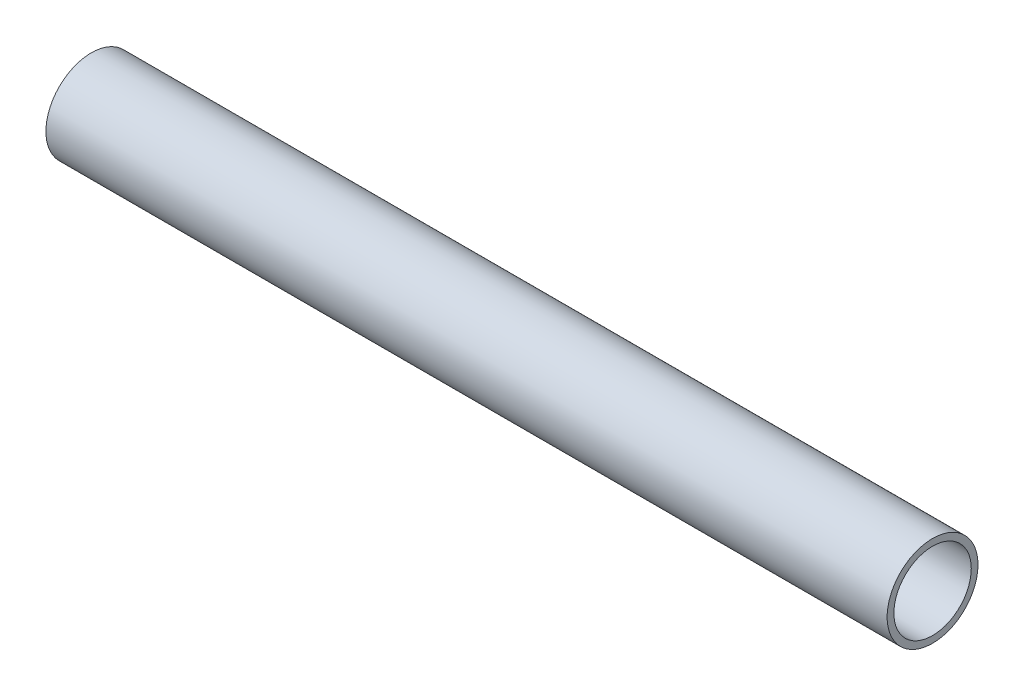
ISO-10303-21;
HEADER;
FILE_DESCRIPTION(('STEP AP214'),'2;1');
FILE_NAME('part.step','',(''),(''),'','','');
FILE_SCHEMA(('AUTOMOTIVE_DESIGN { 1 0 10303 214 1 1 1 1 }'));
ENDSEC;
DATA;
#1=APPLICATION_CONTEXT('core data for automotive mechanical design processes');
#2=APPLICATION_PROTOCOL_DEFINITION('international standard','automotive_design',2000,#1);
#3=PRODUCT_CONTEXT('',#1,'mechanical');
#4=PRODUCT('Part','Part','',(#3));
#5=PRODUCT_RELATED_PRODUCT_CATEGORY('part','',(#4));
#6=PRODUCT_DEFINITION_FORMATION('','',#4);
#7=PRODUCT_DEFINITION_CONTEXT('part definition',#1,'design');
#8=PRODUCT_DEFINITION('design','',#6,#7);
#9=PRODUCT_DEFINITION_SHAPE('','',#8);
#10=(LENGTH_UNIT() NAMED_UNIT(*) SI_UNIT(.MILLI.,.METRE.));
#11=(NAMED_UNIT(*) PLANE_ANGLE_UNIT() SI_UNIT($,.RADIAN.));
#12=(NAMED_UNIT(*) SI_UNIT($,.STERADIAN.) SOLID_ANGLE_UNIT());
#13=UNCERTAINTY_MEASURE_WITH_UNIT(LENGTH_MEASURE(1.E-05),#10,'distance_accuracy_value','');
#14=(GEOMETRIC_REPRESENTATION_CONTEXT(3) GLOBAL_UNCERTAINTY_ASSIGNED_CONTEXT((#13)) GLOBAL_UNIT_ASSIGNED_CONTEXT((#10,
#11,#12)) REPRESENTATION_CONTEXT('',''));
#15=CARTESIAN_POINT('',(0.,0.,0.));
#16=DIRECTION('',(0.,0.,1.));
#17=DIRECTION('',(1.,0.,0.));
#18=AXIS2_PLACEMENT_3D('',#15,#16,#17);
#19=CARTESIAN_POINT('',(-200.,300.,-250.));
#20=DIRECTION('',(-1.,0.,0.));
#21=DIRECTION('',(0.,0.,-1.));
#22=AXIS2_PLACEMENT_3D('',#19,#20,#21);
#23=CYLINDRICAL_SURFACE('',#22,13.5);
#24=CARTESIAN_POINT('',(-200.,300.,-250.));
#25=DIRECTION('',(1.,0.,0.));
#26=DIRECTION('',(0.,0.,-1.));
#27=AXIS2_PLACEMENT_3D('',#24,#25,#26);
#28=CIRCLE('',#27,13.5);
#29=CARTESIAN_POINT('',(-200.,300.,-263.5));
#30=VERTEX_POINT('',#29);
#31=EDGE_CURVE('E10',#30,#30,#28,.T.);
#32=CARTESIAN_POINT('',(-450.,300.,-250.));
#33=DIRECTION('',(1.,0.,0.));
#34=DIRECTION('',(0.,0.,-1.));
#35=AXIS2_PLACEMENT_3D('',#32,#33,#34);
#36=CIRCLE('',#35,13.5);
#37=CARTESIAN_POINT('',(-450.,300.,-263.5));
#38=VERTEX_POINT('',#37);
#39=EDGE_CURVE('E49',#38,#38,#36,.T.);
#40=CARTESIAN_POINT('',(-200.,300.,-263.5));
#41=CARTESIAN_POINT('',(-202.604166666667,300.,-263.5));
#42=CARTESIAN_POINT('',(-205.208333333333,300.,-263.5));
#43=CARTESIAN_POINT('',(-210.416666666667,300.,-263.5));
#44=CARTESIAN_POINT('',(-213.020833333333,300.,-263.5));
#45=CARTESIAN_POINT('',(-218.229166666667,300.,-263.5));
#46=CARTESIAN_POINT('',(-220.833333333333,300.,-263.5));
#47=CARTESIAN_POINT('',(-226.041666666667,300.,-263.5));
#48=CARTESIAN_POINT('',(-228.645833333333,300.,-263.5));
#49=CARTESIAN_POINT('',(-233.854166666667,300.,-263.5));
#50=CARTESIAN_POINT('',(-236.458333333333,300.,-263.5));
#51=CARTESIAN_POINT('',(-241.666666666667,300.,-263.5));
#52=CARTESIAN_POINT('',(-244.270833333333,300.,-263.5));
#53=CARTESIAN_POINT('',(-249.479166666667,300.,-263.5));
#54=CARTESIAN_POINT('',(-252.083333333333,300.,-263.5));
#55=CARTESIAN_POINT('',(-257.291666666667,300.,-263.5));
#56=CARTESIAN_POINT('',(-259.895833333333,300.,-263.5));
#57=CARTESIAN_POINT('',(-265.104166666667,300.,-263.5));
#58=CARTESIAN_POINT('',(-267.708333333333,300.,-263.5));
#59=CARTESIAN_POINT('',(-272.916666666667,300.,-263.5));
#60=CARTESIAN_POINT('',(-275.520833333333,300.,-263.5));
#61=CARTESIAN_POINT('',(-280.729166666667,300.,-263.5));
#62=CARTESIAN_POINT('',(-283.333333333333,300.,-263.5));
#63=CARTESIAN_POINT('',(-288.541666666667,300.,-263.5));
#64=CARTESIAN_POINT('',(-291.145833333333,300.,-263.5));
#65=CARTESIAN_POINT('',(-296.354166666667,300.,-263.5));
#66=CARTESIAN_POINT('',(-298.958333333333,300.,-263.5));
#67=CARTESIAN_POINT('',(-304.166666666667,300.,-263.5));
#68=CARTESIAN_POINT('',(-306.770833333333,300.,-263.5));
#69=CARTESIAN_POINT('',(-311.979166666667,300.,-263.5));
#70=CARTESIAN_POINT('',(-314.583333333333,300.,-263.5));
#71=CARTESIAN_POINT('',(-319.791666666667,300.,-263.5));
#72=CARTESIAN_POINT('',(-322.395833333333,300.,-263.5));
#73=CARTESIAN_POINT('',(-327.604166666667,300.,-263.5));
#74=CARTESIAN_POINT('',(-330.208333333333,300.,-263.5));
#75=CARTESIAN_POINT('',(-335.416666666667,300.,-263.5));
#76=CARTESIAN_POINT('',(-338.020833333333,300.,-263.5));
#77=CARTESIAN_POINT('',(-343.229166666667,300.,-263.5));
#78=CARTESIAN_POINT('',(-345.833333333333,300.,-263.5));
#79=CARTESIAN_POINT('',(-351.041666666667,300.,-263.5));
#80=CARTESIAN_POINT('',(-353.645833333333,300.,-263.5));
#81=CARTESIAN_POINT('',(-358.854166666667,300.,-263.5));
#82=CARTESIAN_POINT('',(-361.458333333333,300.,-263.5));
#83=CARTESIAN_POINT('',(-366.666666666667,300.,-263.5));
#84=CARTESIAN_POINT('',(-369.270833333333,300.,-263.5));
#85=CARTESIAN_POINT('',(-374.479166666667,300.,-263.5));
#86=CARTESIAN_POINT('',(-377.083333333333,300.,-263.5));
#87=CARTESIAN_POINT('',(-382.291666666667,300.,-263.5));
#88=CARTESIAN_POINT('',(-384.895833333333,300.,-263.5));
#89=CARTESIAN_POINT('',(-390.104166666667,300.,-263.5));
#90=CARTESIAN_POINT('',(-392.708333333333,300.,-263.5));
#91=CARTESIAN_POINT('',(-397.916666666667,300.,-263.5));
#92=CARTESIAN_POINT('',(-400.520833333333,300.,-263.5));
#93=CARTESIAN_POINT('',(-405.729166666667,300.,-263.5));
#94=CARTESIAN_POINT('',(-408.333333333333,300.,-263.5));
#95=CARTESIAN_POINT('',(-413.541666666667,300.,-263.5));
#96=CARTESIAN_POINT('',(-416.145833333333,300.,-263.5));
#97=CARTESIAN_POINT('',(-421.354166666667,300.,-263.5));
#98=CARTESIAN_POINT('',(-423.958333333333,300.,-263.5));
#99=CARTESIAN_POINT('',(-429.166666666667,300.,-263.5));
#100=CARTESIAN_POINT('',(-431.770833333333,300.,-263.5));
#101=CARTESIAN_POINT('',(-436.979166666667,300.,-263.5));
#102=CARTESIAN_POINT('',(-439.583333333333,300.,-263.5));
#103=CARTESIAN_POINT('',(-444.791666666667,300.,-263.5));
#104=CARTESIAN_POINT('',(-447.395833333333,300.,-263.5));
#105=CARTESIAN_POINT('',(-450.,300.,-263.5));
#106=B_SPLINE_CURVE_WITH_KNOTS('',3,(#40,#41,#42,#43,#44,#45,#46,#47,#48,#49,#50,#51,#52,#53,
#54,#55,#56,#57,#58,#59,#60,#61,#62,#63,#64,#65,#66,#67,#68,#69,#70,#71,#72,#73,#74,#75,#76,#77,
#78,#79,#80,#81,#82,#83,#84,#85,#86,#87,#88,#89,#90,#91,#92,#93,#94,#95,#96,#97,#98,#99,#100,
#101,#102,#103,#104,#105),.UNSPECIFIED.,.F.,.F.,(4,2,2,2,2,2,2,2,2,2,2,2,2,2,2,2,2,2,2,2,2,2,2,
2,2,2,2,2,2,2,2,2,4),(0.,7.81250000000003,15.625,23.4375,31.25,39.0625,46.875,54.6875000000001,
62.5000000000001,70.3125000000001,78.1250000000001,85.9375000000001,93.7500000000001,101.5625,
109.375,117.1875,125.,132.8125,140.625,148.4375,156.25,164.0625,171.875,179.6875,187.5,195.3125,
203.125,210.9375,218.75,226.5625,234.375,242.1875,250.),.UNSPECIFIED.);
#107=EDGE_CURVE('BSEAM39',#30,#38,#106,.T.);
#108=ORIENTED_EDGE('',*,*,#31,.F.);
#109=ORIENTED_EDGE('',*,*,#39,.T.);
#110=ORIENTED_EDGE('',*,*,#107,.T.);
#111=ORIENTED_EDGE('',*,*,#107,.F.);
#112=EDGE_LOOP('',(#108,#110,#109,#111));
#113=FACE_BOUND('',#112,.T.);
#114=ADVANCED_FACE('F39',(#113),#23,.T.);
#115=CARTESIAN_POINT('',(-200.,300.,-250.));
#116=DIRECTION('',(-1.,0.,0.));
#117=DIRECTION('',(0.,0.,-1.));
#118=AXIS2_PLACEMENT_3D('',#115,#116,#117);
#119=PLANE('',#118);
#120=CARTESIAN_POINT('',(-200.,300.,-250.));
#121=DIRECTION('',(1.,0.,0.));
#122=DIRECTION('',(0.,0.,-1.));
#123=AXIS2_PLACEMENT_3D('',#120,#121,#122);
#124=CIRCLE('',#123,11.5);
#125=CARTESIAN_POINT('',(-200.,300.,-261.5));
#126=VERTEX_POINT('',#125);
#127=EDGE_CURVE('E45',#126,#126,#124,.T.);
#128=ORIENTED_EDGE('',*,*,#127,.F.);
#129=EDGE_LOOP('',(#128));
#130=FACE_BOUND('',#129,.T.);
#131=ORIENTED_EDGE('',*,*,#31,.T.);
#132=EDGE_LOOP('',(#131));
#133=FACE_BOUND('',#132,.T.);
#134=ADVANCED_FACE('F63',(#130,#133),#119,.F.);
#135=CARTESIAN_POINT('',(-200.,300.,-250.));
#136=DIRECTION('',(-1.,0.,0.));
#137=DIRECTION('',(0.,0.,-1.));
#138=AXIS2_PLACEMENT_3D('',#135,#136,#137);
#139=CYLINDRICAL_SURFACE('',#138,11.5);
#140=CARTESIAN_POINT('',(-450.,300.,-250.));
#141=DIRECTION('',(1.,0.,0.));
#142=DIRECTION('',(0.,0.,-1.));
#143=AXIS2_PLACEMENT_3D('',#140,#141,#142);
#144=CIRCLE('',#143,11.5);
#145=CARTESIAN_POINT('',(-450.,300.,-261.5));
#146=VERTEX_POINT('',#145);
#147=EDGE_CURVE('E53',#146,#146,#144,.T.);
#148=CARTESIAN_POINT('',(-200.,300.,-261.5));
#149=CARTESIAN_POINT('',(-202.604166666667,300.,-261.5));
#150=CARTESIAN_POINT('',(-205.208333333333,300.,-261.5));
#151=CARTESIAN_POINT('',(-210.416666666667,300.,-261.5));
#152=CARTESIAN_POINT('',(-213.020833333333,300.,-261.5));
#153=CARTESIAN_POINT('',(-218.229166666667,300.,-261.5));
#154=CARTESIAN_POINT('',(-220.833333333333,300.,-261.5));
#155=CARTESIAN_POINT('',(-226.041666666667,300.,-261.5));
#156=CARTESIAN_POINT('',(-228.645833333333,300.,-261.5));
#157=CARTESIAN_POINT('',(-233.854166666667,300.,-261.5));
#158=CARTESIAN_POINT('',(-236.458333333333,300.,-261.5));
#159=CARTESIAN_POINT('',(-241.666666666667,300.,-261.5));
#160=CARTESIAN_POINT('',(-244.270833333333,300.,-261.5));
#161=CARTESIAN_POINT('',(-249.479166666667,300.,-261.5));
#162=CARTESIAN_POINT('',(-252.083333333333,300.,-261.5));
#163=CARTESIAN_POINT('',(-257.291666666667,300.,-261.5));
#164=CARTESIAN_POINT('',(-259.895833333333,300.,-261.5));
#165=CARTESIAN_POINT('',(-265.104166666667,300.,-261.5));
#166=CARTESIAN_POINT('',(-267.708333333333,300.,-261.5));
#167=CARTESIAN_POINT('',(-272.916666666667,300.,-261.5));
#168=CARTESIAN_POINT('',(-275.520833333333,300.,-261.5));
#169=CARTESIAN_POINT('',(-280.729166666667,300.,-261.5));
#170=CARTESIAN_POINT('',(-283.333333333333,300.,-261.5));
#171=CARTESIAN_POINT('',(-288.541666666667,300.,-261.5));
#172=CARTESIAN_POINT('',(-291.145833333333,300.,-261.5));
#173=CARTESIAN_POINT('',(-296.354166666667,300.,-261.5));
#174=CARTESIAN_POINT('',(-298.958333333333,300.,-261.5));
#175=CARTESIAN_POINT('',(-304.166666666667,300.,-261.5));
#176=CARTESIAN_POINT('',(-306.770833333333,300.,-261.5));
#177=CARTESIAN_POINT('',(-311.979166666667,300.,-261.5));
#178=CARTESIAN_POINT('',(-314.583333333333,300.,-261.5));
#179=CARTESIAN_POINT('',(-319.791666666667,300.,-261.5));
#180=CARTESIAN_POINT('',(-322.395833333333,300.,-261.5));
#181=CARTESIAN_POINT('',(-327.604166666667,300.,-261.5));
#182=CARTESIAN_POINT('',(-330.208333333333,300.,-261.5));
#183=CARTESIAN_POINT('',(-335.416666666667,300.,-261.5));
#184=CARTESIAN_POINT('',(-338.020833333333,300.,-261.5));
#185=CARTESIAN_POINT('',(-343.229166666667,300.,-261.5));
#186=CARTESIAN_POINT('',(-345.833333333333,300.,-261.5));
#187=CARTESIAN_POINT('',(-351.041666666667,300.,-261.5));
#188=CARTESIAN_POINT('',(-353.645833333333,300.,-261.5));
#189=CARTESIAN_POINT('',(-358.854166666667,300.,-261.5));
#190=CARTESIAN_POINT('',(-361.458333333333,300.,-261.5));
#191=CARTESIAN_POINT('',(-366.666666666667,300.,-261.5));
#192=CARTESIAN_POINT('',(-369.270833333333,300.,-261.5));
#193=CARTESIAN_POINT('',(-374.479166666667,300.,-261.5));
#194=CARTESIAN_POINT('',(-377.083333333333,300.,-261.5));
#195=CARTESIAN_POINT('',(-382.291666666667,300.,-261.5));
#196=CARTESIAN_POINT('',(-384.895833333333,300.,-261.5));
#197=CARTESIAN_POINT('',(-390.104166666667,300.,-261.5));
#198=CARTESIAN_POINT('',(-392.708333333333,300.,-261.5));
#199=CARTESIAN_POINT('',(-397.916666666667,300.,-261.5));
#200=CARTESIAN_POINT('',(-400.520833333333,300.,-261.5));
#201=CARTESIAN_POINT('',(-405.729166666667,300.,-261.5));
#202=CARTESIAN_POINT('',(-408.333333333333,300.,-261.5));
#203=CARTESIAN_POINT('',(-413.541666666667,300.,-261.5));
#204=CARTESIAN_POINT('',(-416.145833333333,300.,-261.5));
#205=CARTESIAN_POINT('',(-421.354166666667,300.,-261.5));
#206=CARTESIAN_POINT('',(-423.958333333333,300.,-261.5));
#207=CARTESIAN_POINT('',(-429.166666666667,300.,-261.5));
#208=CARTESIAN_POINT('',(-431.770833333333,300.,-261.5));
#209=CARTESIAN_POINT('',(-436.979166666667,300.,-261.5));
#210=CARTESIAN_POINT('',(-439.583333333333,300.,-261.5));
#211=CARTESIAN_POINT('',(-444.791666666667,300.,-261.5));
#212=CARTESIAN_POINT('',(-447.395833333333,300.,-261.5));
#213=CARTESIAN_POINT('',(-450.,300.,-261.5));
#214=B_SPLINE_CURVE_WITH_KNOTS('',3,(#148,#149,#150,#151,#152,#153,#154,#155,#156,#157,#158,
#159,#160,#161,#162,#163,#164,#165,#166,#167,#168,#169,#170,#171,#172,#173,#174,#175,#176,#177,
#178,#179,#180,#181,#182,#183,#184,#185,#186,#187,#188,#189,#190,#191,#192,#193,#194,#195,#196,
#197,#198,#199,#200,#201,#202,#203,#204,#205,#206,#207,#208,#209,#210,#211,#212,#213),
.UNSPECIFIED.,.F.,.F.,(4,2,2,2,2,2,2,2,2,2,2,2,2,2,2,2,2,2,2,2,2,2,2,2,2,2,2,2,2,2,2,2,4),(0.,
7.81250000000003,15.625,23.4375,31.25,39.0625,46.875,54.6875000000001,62.5000000000001,
70.3125000000001,78.1250000000001,85.9375000000001,93.7500000000001,101.5625,109.375,117.1875,
125.,132.8125,140.625,148.4375,156.25,164.0625,171.875,179.6875,187.5,195.3125,203.125,210.9375,
218.75,226.5625,234.375,242.1875,250.),.UNSPECIFIED.);
#215=EDGE_CURVE('BSEAM61',#126,#146,#214,.T.);
#216=ORIENTED_EDGE('',*,*,#127,.T.);
#217=ORIENTED_EDGE('',*,*,#147,.F.);
#218=ORIENTED_EDGE('',*,*,#215,.T.);
#219=ORIENTED_EDGE('',*,*,#215,.F.);
#220=EDGE_LOOP('',(#216,#218,#217,#219));
#221=FACE_BOUND('',#220,.T.);
#222=ADVANCED_FACE('F61',(#221),#139,.F.);
#223=CARTESIAN_POINT('',(-450.,300.,-250.));
#224=DIRECTION('',(-1.,0.,0.));
#225=DIRECTION('',(0.,0.,-1.));
#226=AXIS2_PLACEMENT_3D('',#223,#224,#225);
#227=PLANE('',#226);
#228=ORIENTED_EDGE('',*,*,#39,.F.);
#229=EDGE_LOOP('',(#228));
#230=FACE_BOUND('',#229,.T.);
#231=ORIENTED_EDGE('',*,*,#147,.T.);
#232=EDGE_LOOP('',(#231));
#233=FACE_BOUND('',#232,.T.);
#234=ADVANCED_FACE('F59',(#230,#233),#227,.T.);
#235=CLOSED_SHELL('',(#114,#134,#222,#234));
#236=MANIFOLD_SOLID_BREP('B2',#235);
#237=ADVANCED_BREP_SHAPE_REPRESENTATION('',(#18,#236),#14);
#238=SHAPE_DEFINITION_REPRESENTATION(#9,#237);
ENDSEC;
END-ISO-10303-21;
